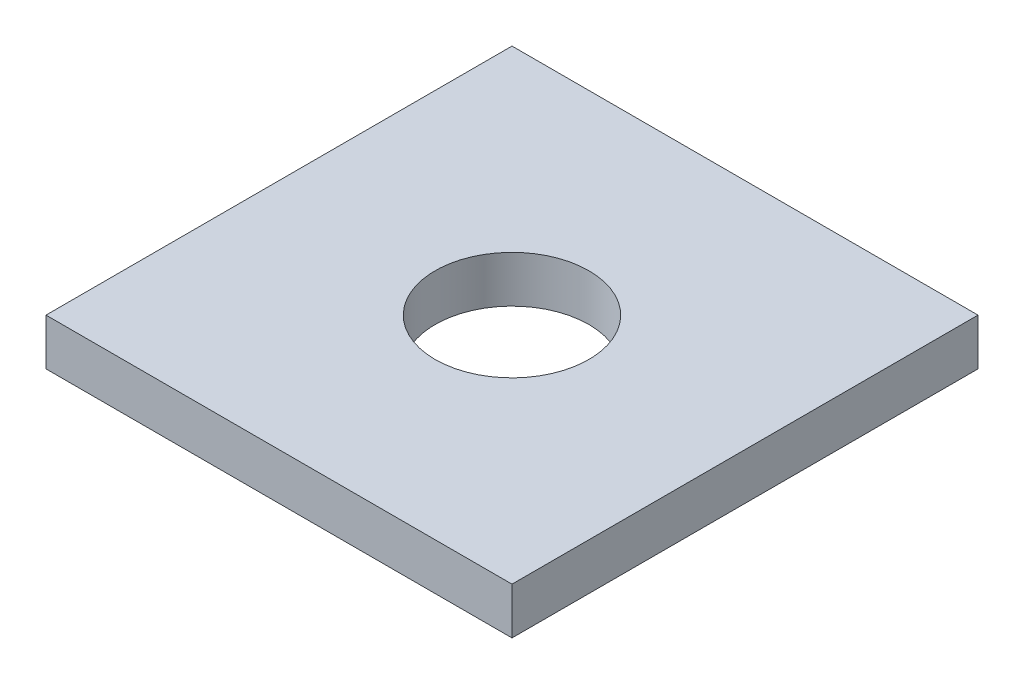
ISO-10303-21;
HEADER;
FILE_DESCRIPTION(('STEP AP214'),'2;1');
FILE_NAME('part.step','',(''),(''),'','','');
FILE_SCHEMA(('AUTOMOTIVE_DESIGN { 1 0 10303 214 1 1 1 1 }'));
ENDSEC;
DATA;
#1=APPLICATION_CONTEXT('core data for automotive mechanical design processes');
#2=APPLICATION_PROTOCOL_DEFINITION('international standard','automotive_design',2000,#1);
#3=PRODUCT_CONTEXT('',#1,'mechanical');
#4=PRODUCT('Part','Part','',(#3));
#5=PRODUCT_RELATED_PRODUCT_CATEGORY('part','',(#4));
#6=PRODUCT_DEFINITION_FORMATION('','',#4);
#7=PRODUCT_DEFINITION_CONTEXT('part definition',#1,'design');
#8=PRODUCT_DEFINITION('design','',#6,#7);
#9=PRODUCT_DEFINITION_SHAPE('','',#8);
#10=(LENGTH_UNIT() NAMED_UNIT(*) SI_UNIT(.MILLI.,.METRE.));
#11=(NAMED_UNIT(*) PLANE_ANGLE_UNIT() SI_UNIT($,.RADIAN.));
#12=(NAMED_UNIT(*) SI_UNIT($,.STERADIAN.) SOLID_ANGLE_UNIT());
#13=UNCERTAINTY_MEASURE_WITH_UNIT(LENGTH_MEASURE(1.E-05),#10,'distance_accuracy_value','');
#14=(GEOMETRIC_REPRESENTATION_CONTEXT(3) GLOBAL_UNCERTAINTY_ASSIGNED_CONTEXT((#13)) GLOBAL_UNIT_ASSIGNED_CONTEXT((#10,
#11,#12)) REPRESENTATION_CONTEXT('',''));
#15=CARTESIAN_POINT('',(0.,0.,0.));
#16=DIRECTION('',(0.,0.,1.));
#17=DIRECTION('',(1.,0.,0.));
#18=AXIS2_PLACEMENT_3D('',#15,#16,#17);
#19=CARTESIAN_POINT('',(50.,10.,0.));
#20=DIRECTION('',(1.,0.,0.));
#21=DIRECTION('',(0.,0.,-1.));
#22=AXIS2_PLACEMENT_3D('',#19,#20,#21);
#23=PLANE('',#22);
#24=DIRECTION('',(0.,0.,1.));
#25=VECTOR('',#24,1.);
#26=CARTESIAN_POINT('',(50.,0.,0.));
#27=LINE('',#26,#25);
#28=CARTESIAN_POINT('',(50.,0.,-50.));
#29=VERTEX_POINT('',#28);
#30=CARTESIAN_POINT('',(50.,0.,50.));
#31=VERTEX_POINT('',#30);
#32=EDGE_CURVE('E100',#29,#31,#27,.T.);
#33=ORIENTED_EDGE('',*,*,#32,.F.);
#34=DIRECTION('',(0.,-1.,0.));
#35=VECTOR('',#34,1.);
#36=CARTESIAN_POINT('',(50.,10.,-50.));
#37=LINE('',#36,#35);
#38=CARTESIAN_POINT('',(50.,10.,-50.));
#39=VERTEX_POINT('',#38);
#40=EDGE_CURVE('E11',#39,#29,#37,.T.);
#41=ORIENTED_EDGE('',*,*,#40,.F.);
#42=DIRECTION('',(0.,0.,1.));
#43=VECTOR('',#42,1.);
#44=CARTESIAN_POINT('',(50.,10.,0.));
#45=LINE('',#44,#43);
#46=CARTESIAN_POINT('',(50.,10.,50.));
#47=VERTEX_POINT('',#46);
#48=EDGE_CURVE('E91',#39,#47,#45,.T.);
#49=ORIENTED_EDGE('',*,*,#48,.T.);
#50=DIRECTION('',(0.,-1.,0.));
#51=VECTOR('',#50,1.);
#52=CARTESIAN_POINT('',(50.,10.,50.));
#53=LINE('',#52,#51);
#54=EDGE_CURVE('E71',#47,#31,#53,.T.);
#55=ORIENTED_EDGE('',*,*,#54,.T.);
#56=EDGE_LOOP('',(#33,#41,#49,#55));
#57=FACE_BOUND('',#56,.T.);
#58=ADVANCED_FACE('F33',(#57),#23,.T.);
#59=CARTESIAN_POINT('',(0.,10.,-50.));
#60=DIRECTION('',(0.,0.,-1.));
#61=DIRECTION('',(-1.,0.,0.));
#62=AXIS2_PLACEMENT_3D('',#59,#60,#61);
#63=PLANE('',#62);
#64=DIRECTION('',(1.,0.,0.));
#65=VECTOR('',#64,1.);
#66=CARTESIAN_POINT('',(0.,0.,-50.));
#67=LINE('',#66,#65);
#68=CARTESIAN_POINT('',(-50.,0.,-50.));
#69=VERTEX_POINT('',#68);
#70=EDGE_CURVE('E84',#69,#29,#67,.T.);
#71=ORIENTED_EDGE('',*,*,#70,.F.);
#72=DIRECTION('',(0.,-1.,0.));
#73=VECTOR('',#72,1.);
#74=CARTESIAN_POINT('',(-50.,10.,-50.));
#75=LINE('',#74,#73);
#76=CARTESIAN_POINT('',(-50.,10.,-50.));
#77=VERTEX_POINT('',#76);
#78=EDGE_CURVE('E41',#77,#69,#75,.T.);
#79=ORIENTED_EDGE('',*,*,#78,.F.);
#80=DIRECTION('',(1.,0.,0.));
#81=VECTOR('',#80,1.);
#82=CARTESIAN_POINT('',(0.,10.,-50.));
#83=LINE('',#82,#81);
#84=EDGE_CURVE('E82',#77,#39,#83,.T.);
#85=ORIENTED_EDGE('',*,*,#84,.T.);
#86=ORIENTED_EDGE('',*,*,#40,.T.);
#87=EDGE_LOOP('',(#71,#79,#85,#86));
#88=FACE_BOUND('',#87,.T.);
#89=ADVANCED_FACE('F80',(#88),#63,.T.);
#90=CARTESIAN_POINT('',(-50.,10.,0.));
#91=DIRECTION('',(1.,0.,0.));
#92=DIRECTION('',(0.,0.,-1.));
#93=AXIS2_PLACEMENT_3D('',#90,#91,#92);
#94=PLANE('',#93);
#95=DIRECTION('',(0.,0.,1.));
#96=VECTOR('',#95,1.);
#97=CARTESIAN_POINT('',(-50.,0.,0.));
#98=LINE('',#97,#96);
#99=CARTESIAN_POINT('',(-50.,0.,50.));
#100=VERTEX_POINT('',#99);
#101=EDGE_CURVE('E64',#69,#100,#98,.T.);
#102=ORIENTED_EDGE('',*,*,#101,.T.);
#103=DIRECTION('',(0.,-1.,0.));
#104=VECTOR('',#103,1.);
#105=CARTESIAN_POINT('',(-50.,10.,50.));
#106=LINE('',#105,#104);
#107=CARTESIAN_POINT('',(-50.,10.,50.));
#108=VERTEX_POINT('',#107);
#109=EDGE_CURVE('E85',#108,#100,#106,.T.);
#110=ORIENTED_EDGE('',*,*,#109,.F.);
#111=DIRECTION('',(0.,0.,1.));
#112=VECTOR('',#111,1.);
#113=CARTESIAN_POINT('',(-50.,10.,0.));
#114=LINE('',#113,#112);
#115=EDGE_CURVE('E86',#77,#108,#114,.T.);
#116=ORIENTED_EDGE('',*,*,#115,.F.);
#117=ORIENTED_EDGE('',*,*,#78,.T.);
#118=EDGE_LOOP('',(#102,#110,#116,#117));
#119=FACE_BOUND('',#118,.T.);
#120=ADVANCED_FACE('F87',(#119),#94,.F.);
#121=CARTESIAN_POINT('',(0.,10.,50.));
#122=DIRECTION('',(0.,0.,-1.));
#123=DIRECTION('',(-1.,0.,0.));
#124=AXIS2_PLACEMENT_3D('',#121,#122,#123);
#125=PLANE('',#124);
#126=DIRECTION('',(1.,0.,0.));
#127=VECTOR('',#126,1.);
#128=CARTESIAN_POINT('',(0.,0.,50.));
#129=LINE('',#128,#127);
#130=EDGE_CURVE('E105',#100,#31,#129,.T.);
#131=ORIENTED_EDGE('',*,*,#130,.T.);
#132=ORIENTED_EDGE('',*,*,#54,.F.);
#133=DIRECTION('',(1.,0.,0.));
#134=VECTOR('',#133,1.);
#135=CARTESIAN_POINT('',(0.,10.,50.));
#136=LINE('',#135,#134);
#137=EDGE_CURVE('E49',#108,#47,#136,.T.);
#138=ORIENTED_EDGE('',*,*,#137,.F.);
#139=ORIENTED_EDGE('',*,*,#109,.T.);
#140=EDGE_LOOP('',(#131,#132,#138,#139));
#141=FACE_BOUND('',#140,.T.);
#142=ADVANCED_FACE('F112',(#141),#125,.F.);
#143=CARTESIAN_POINT('',(0.,10.,0.));
#144=DIRECTION('',(0.,-1.,0.));
#145=DIRECTION('',(0.,0.,-1.));
#146=AXIS2_PLACEMENT_3D('',#143,#144,#145);
#147=CYLINDRICAL_SURFACE('',#146,16.5);
#148=CARTESIAN_POINT('',(0.,10.,0.));
#149=DIRECTION('',(0.,1.,0.));
#150=DIRECTION('',(0.,0.,1.));
#151=AXIS2_PLACEMENT_3D('',#148,#149,#150);
#152=CIRCLE('',#151,16.5);
#153=CARTESIAN_POINT('',(0.,10.,16.5));
#154=VERTEX_POINT('',#153);
#155=EDGE_CURVE('E97',#154,#154,#152,.T.);
#156=ORIENTED_EDGE('',*,*,#155,.T.);
#157=EDGE_LOOP('',(#156));
#158=FACE_BOUND('',#157,.T.);
#159=CARTESIAN_POINT('',(0.,0.,0.));
#160=DIRECTION('',(0.,1.,0.));
#161=DIRECTION('',(0.,0.,1.));
#162=AXIS2_PLACEMENT_3D('',#159,#160,#161);
#163=CIRCLE('',#162,16.5);
#164=CARTESIAN_POINT('',(0.,0.,16.5));
#165=VERTEX_POINT('',#164);
#166=EDGE_CURVE('E93',#165,#165,#163,.T.);
#167=ORIENTED_EDGE('',*,*,#166,.F.);
#168=EDGE_LOOP('',(#167));
#169=FACE_BOUND('',#168,.T.);
#170=ADVANCED_FACE('F127',(#158,#169),#147,.F.);
#171=CARTESIAN_POINT('',(0.,10.,0.));
#172=DIRECTION('',(0.,1.,0.));
#173=DIRECTION('',(0.,0.,1.));
#174=AXIS2_PLACEMENT_3D('',#171,#172,#173);
#175=PLANE('',#174);
#176=ORIENTED_EDGE('',*,*,#48,.F.);
#177=ORIENTED_EDGE('',*,*,#84,.F.);
#178=ORIENTED_EDGE('',*,*,#115,.T.);
#179=ORIENTED_EDGE('',*,*,#137,.T.);
#180=EDGE_LOOP('',(#176,#177,#178,#179));
#181=FACE_BOUND('',#180,.T.);
#182=ORIENTED_EDGE('',*,*,#155,.F.);
#183=EDGE_LOOP('',(#182));
#184=FACE_BOUND('',#183,.T.);
#185=ADVANCED_FACE('F89',(#181,#184),#175,.T.);
#186=CARTESIAN_POINT('',(0.,0.,0.));
#187=DIRECTION('',(0.,1.,0.));
#188=DIRECTION('',(0.,0.,1.));
#189=AXIS2_PLACEMENT_3D('',#186,#187,#188);
#190=PLANE('',#189);
#191=ORIENTED_EDGE('',*,*,#32,.T.);
#192=ORIENTED_EDGE('',*,*,#130,.F.);
#193=ORIENTED_EDGE('',*,*,#101,.F.);
#194=ORIENTED_EDGE('',*,*,#70,.T.);
#195=EDGE_LOOP('',(#191,#192,#193,#194));
#196=FACE_BOUND('',#195,.T.);
#197=ORIENTED_EDGE('',*,*,#166,.T.);
#198=EDGE_LOOP('',(#197));
#199=FACE_BOUND('',#198,.T.);
#200=ADVANCED_FACE('F114',(#196,#199),#190,.F.);
#201=CLOSED_SHELL('',(#58,#89,#120,#142,#170,#185,#200));
#202=MANIFOLD_SOLID_BREP('B2',#201);
#203=ADVANCED_BREP_SHAPE_REPRESENTATION('',(#18,#202),#14);
#204=SHAPE_DEFINITION_REPRESENTATION(#9,#203);
ENDSEC;
END-ISO-10303-21;
